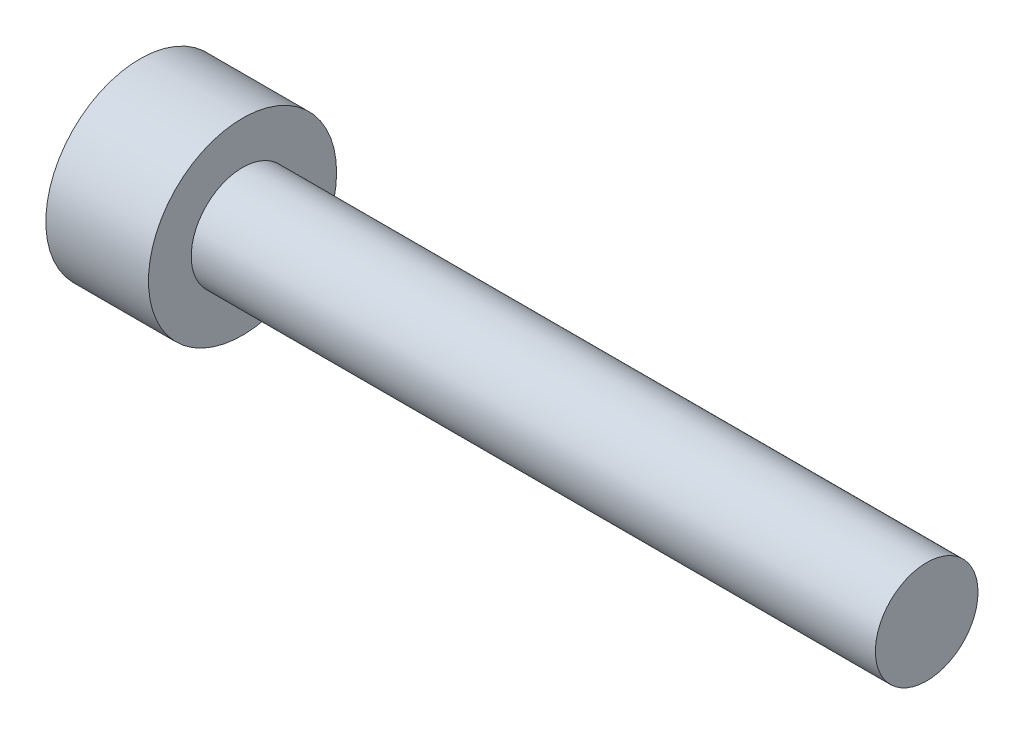
ISO-10303-21;
HEADER;
FILE_DESCRIPTION(('STEP AP214'),'2;1');
FILE_NAME('part.step','',(''),(''),'','','');
FILE_SCHEMA(('AUTOMOTIVE_DESIGN { 1 0 10303 214 1 1 1 1 }'));
ENDSEC;
DATA;
#1=APPLICATION_CONTEXT('core data for automotive mechanical design processes');
#2=APPLICATION_PROTOCOL_DEFINITION('international standard','automotive_design',2000,#1);
#3=PRODUCT_CONTEXT('',#1,'mechanical');
#4=PRODUCT('Part','Part','',(#3));
#5=PRODUCT_RELATED_PRODUCT_CATEGORY('part','',(#4));
#6=PRODUCT_DEFINITION_FORMATION('','',#4);
#7=PRODUCT_DEFINITION_CONTEXT('part definition',#1,'design');
#8=PRODUCT_DEFINITION('design','',#6,#7);
#9=PRODUCT_DEFINITION_SHAPE('','',#8);
#10=(LENGTH_UNIT() NAMED_UNIT(*) SI_UNIT(.MILLI.,.METRE.));
#11=(NAMED_UNIT(*) PLANE_ANGLE_UNIT() SI_UNIT($,.RADIAN.));
#12=(NAMED_UNIT(*) SI_UNIT($,.STERADIAN.) SOLID_ANGLE_UNIT());
#13=UNCERTAINTY_MEASURE_WITH_UNIT(LENGTH_MEASURE(1.E-05),#10,'distance_accuracy_value','');
#14=(GEOMETRIC_REPRESENTATION_CONTEXT(3) GLOBAL_UNCERTAINTY_ASSIGNED_CONTEXT((#13)) GLOBAL_UNIT_ASSIGNED_CONTEXT((#10,
#11,#12)) REPRESENTATION_CONTEXT('',''));
#15=CARTESIAN_POINT('',(0.,0.,0.));
#16=DIRECTION('',(0.,0.,1.));
#17=DIRECTION('',(1.,0.,0.));
#18=AXIS2_PLACEMENT_3D('',#15,#16,#17);
#19=CARTESIAN_POINT('',(3.,0.,0.));
#20=DIRECTION('',(-1.,0.,0.));
#21=DIRECTION('',(0.,0.,1.));
#22=AXIS2_PLACEMENT_3D('',#19,#20,#21);
#23=CYLINDRICAL_SURFACE('',#22,2.75);
#24=CARTESIAN_POINT('',(3.,0.,0.));
#25=DIRECTION('',(1.,0.,0.));
#26=DIRECTION('',(0.,0.,-1.));
#27=AXIS2_PLACEMENT_3D('',#24,#25,#26);
#28=CIRCLE('',#27,2.75);
#29=CARTESIAN_POINT('',(3.,0.,-2.75));
#30=VERTEX_POINT('',#29);
#31=EDGE_CURVE('E42',#30,#30,#28,.T.);
#32=ORIENTED_EDGE('',*,*,#31,.F.);
#33=EDGE_LOOP('',(#32));
#34=FACE_BOUND('',#33,.T.);
#35=CARTESIAN_POINT('',(0.,0.,0.));
#36=DIRECTION('',(1.,0.,0.));
#37=DIRECTION('',(0.,0.,-1.));
#38=AXIS2_PLACEMENT_3D('',#35,#36,#37);
#39=CIRCLE('',#38,2.75);
#40=CARTESIAN_POINT('',(0.,0.,-2.75));
#41=VERTEX_POINT('',#40);
#42=EDGE_CURVE('E37',#41,#41,#39,.T.);
#43=ORIENTED_EDGE('',*,*,#42,.T.);
#44=EDGE_LOOP('',(#43));
#45=FACE_BOUND('',#44,.T.);
#46=ADVANCED_FACE('F40',(#34,#45),#23,.T.);
#47=CARTESIAN_POINT('',(3.,0.,0.));
#48=DIRECTION('',(1.,0.,0.));
#49=DIRECTION('',(0.,0.,-1.));
#50=AXIS2_PLACEMENT_3D('',#47,#48,#49);
#51=PLANE('',#50);
#52=CARTESIAN_POINT('',(3.,0.,0.));
#53=DIRECTION('',(1.,0.,0.));
#54=DIRECTION('',(0.,0.,-1.));
#55=AXIS2_PLACEMENT_3D('',#52,#53,#54);
#56=CIRCLE('',#55,1.5);
#57=CARTESIAN_POINT('',(3.,0.,-1.5));
#58=VERTEX_POINT('',#57);
#59=EDGE_CURVE('E10',#58,#58,#56,.T.);
#60=ORIENTED_EDGE('',*,*,#59,.F.);
#61=EDGE_LOOP('',(#60));
#62=FACE_BOUND('',#61,.T.);
#63=ORIENTED_EDGE('',*,*,#31,.T.);
#64=EDGE_LOOP('',(#63));
#65=FACE_BOUND('',#64,.T.);
#66=ADVANCED_FACE('F62',(#62,#65),#51,.T.);
#67=CARTESIAN_POINT('',(0.,0.,0.));
#68=DIRECTION('',(1.,0.,0.));
#69=DIRECTION('',(0.,0.,-1.));
#70=AXIS2_PLACEMENT_3D('',#67,#68,#69);
#71=PLANE('',#70);
#72=ORIENTED_EDGE('',*,*,#42,.F.);
#73=EDGE_LOOP('',(#72));
#74=FACE_BOUND('',#73,.T.);
#75=ADVANCED_FACE('F59',(#74),#71,.F.);
#76=CARTESIAN_POINT('',(23.,0.,0.));
#77=DIRECTION('',(-1.,0.,0.));
#78=DIRECTION('',(0.,0.,1.));
#79=AXIS2_PLACEMENT_3D('',#76,#77,#78);
#80=CYLINDRICAL_SURFACE('',#79,1.5);
#81=CARTESIAN_POINT('',(23.,0.,0.));
#82=DIRECTION('',(1.,0.,0.));
#83=DIRECTION('',(0.,0.,-1.));
#84=AXIS2_PLACEMENT_3D('',#81,#82,#83);
#85=CIRCLE('',#84,1.5);
#86=CARTESIAN_POINT('',(23.,0.,-1.5));
#87=VERTEX_POINT('',#86);
#88=EDGE_CURVE('E49',#87,#87,#85,.T.);
#89=ORIENTED_EDGE('',*,*,#88,.F.);
#90=EDGE_LOOP('',(#89));
#91=FACE_BOUND('',#90,.T.);
#92=ORIENTED_EDGE('',*,*,#59,.T.);
#93=EDGE_LOOP('',(#92));
#94=FACE_BOUND('',#93,.T.);
#95=ADVANCED_FACE('F58',(#91,#94),#80,.T.);
#96=CARTESIAN_POINT('',(23.,0.,0.));
#97=DIRECTION('',(1.,0.,0.));
#98=DIRECTION('',(0.,0.,-1.));
#99=AXIS2_PLACEMENT_3D('',#96,#97,#98);
#100=PLANE('',#99);
#101=ORIENTED_EDGE('',*,*,#88,.T.);
#102=EDGE_LOOP('',(#101));
#103=FACE_BOUND('',#102,.T.);
#104=ADVANCED_FACE('F66',(#103),#100,.T.);
#105=CLOSED_SHELL('',(#46,#66,#75,#95,#104));
#106=MANIFOLD_SOLID_BREP('B2',#105);
#107=ADVANCED_BREP_SHAPE_REPRESENTATION('',(#18,#106),#14);
#108=SHAPE_DEFINITION_REPRESENTATION(#9,#107);
ENDSEC;
END-ISO-10303-21;
